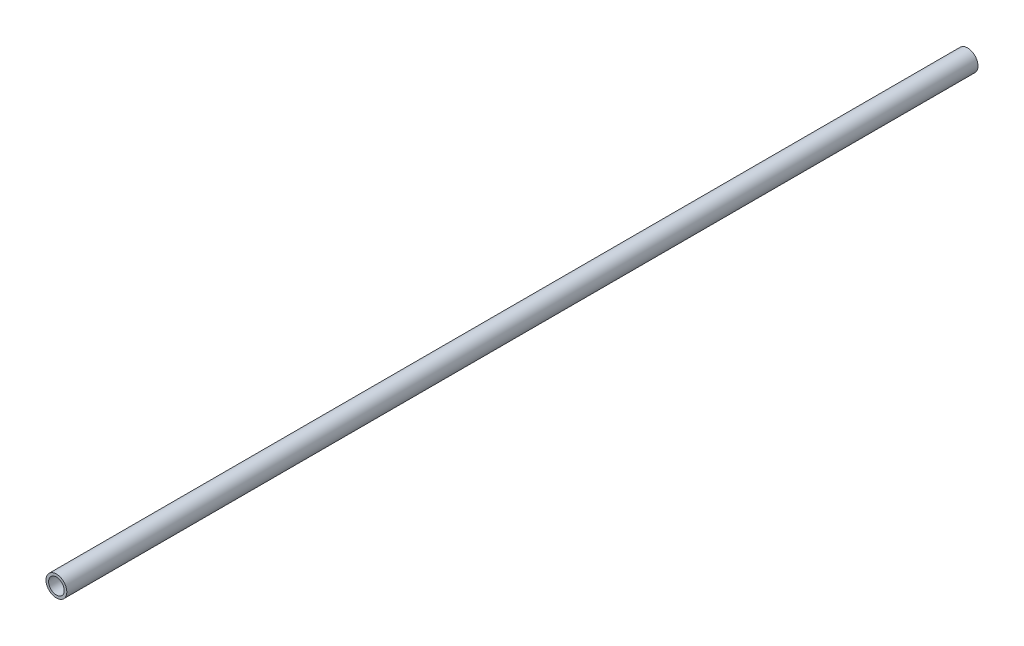
ISO-10303-21;
HEADER;
FILE_DESCRIPTION(('STEP AP214'),'2;1');
FILE_NAME('part.step','',(''),(''),'','','');
FILE_SCHEMA(('AUTOMOTIVE_DESIGN { 1 0 10303 214 1 1 1 1 }'));
ENDSEC;
DATA;
#1=APPLICATION_CONTEXT('core data for automotive mechanical design processes');
#2=APPLICATION_PROTOCOL_DEFINITION('international standard','automotive_design',2000,#1);
#3=PRODUCT_CONTEXT('',#1,'mechanical');
#4=PRODUCT('Part','Part','',(#3));
#5=PRODUCT_RELATED_PRODUCT_CATEGORY('part','',(#4));
#6=PRODUCT_DEFINITION_FORMATION('','',#4);
#7=PRODUCT_DEFINITION_CONTEXT('part definition',#1,'design');
#8=PRODUCT_DEFINITION('design','',#6,#7);
#9=PRODUCT_DEFINITION_SHAPE('','',#8);
#10=(LENGTH_UNIT() NAMED_UNIT(*) SI_UNIT(.MILLI.,.METRE.));
#11=(NAMED_UNIT(*) PLANE_ANGLE_UNIT() SI_UNIT($,.RADIAN.));
#12=(NAMED_UNIT(*) SI_UNIT($,.STERADIAN.) SOLID_ANGLE_UNIT());
#13=UNCERTAINTY_MEASURE_WITH_UNIT(LENGTH_MEASURE(1.E-05),#10,'distance_accuracy_value','');
#14=(GEOMETRIC_REPRESENTATION_CONTEXT(3) GLOBAL_UNCERTAINTY_ASSIGNED_CONTEXT((#13)) GLOBAL_UNIT_ASSIGNED_CONTEXT((#10,
#11,#12)) REPRESENTATION_CONTEXT('',''));
#15=CARTESIAN_POINT('',(0.,0.,0.));
#16=DIRECTION('',(0.,0.,1.));
#17=DIRECTION('',(1.,0.,0.));
#18=AXIS2_PLACEMENT_3D('',#15,#16,#17);
#19=CARTESIAN_POINT('',(0.,0.,350.));
#20=DIRECTION('',(0.,0.,1.));
#21=DIRECTION('',(1.,0.,0.));
#22=AXIS2_PLACEMENT_3D('',#19,#20,#21);
#23=PLANE('',#22);
#24=CARTESIAN_POINT('',(0.,0.,350.));
#25=DIRECTION('',(0.,0.,1.));
#26=DIRECTION('',(1.,0.,0.));
#27=AXIS2_PLACEMENT_3D('',#24,#25,#26);
#28=CIRCLE('',#27,4.);
#29=CARTESIAN_POINT('',(4.,0.,350.));
#30=VERTEX_POINT('',#29);
#31=EDGE_CURVE('E10',#30,#30,#28,.T.);
#32=ORIENTED_EDGE('',*,*,#31,.T.);
#33=EDGE_LOOP('',(#32));
#34=FACE_BOUND('',#33,.T.);
#35=CARTESIAN_POINT('',(0.,0.,350.));
#36=DIRECTION('',(0.,0.,1.));
#37=DIRECTION('',(1.,0.,0.));
#38=AXIS2_PLACEMENT_3D('',#35,#36,#37);
#39=CIRCLE('',#38,3.);
#40=CARTESIAN_POINT('',(3.,0.,350.));
#41=VERTEX_POINT('',#40);
#42=EDGE_CURVE('E46',#41,#41,#39,.T.);
#43=ORIENTED_EDGE('',*,*,#42,.F.);
#44=EDGE_LOOP('',(#43));
#45=FACE_BOUND('',#44,.T.);
#46=ADVANCED_FACE('F35',(#34,#45),#23,.T.);
#47=CARTESIAN_POINT('',(0.,0.,0.));
#48=DIRECTION('',(0.,0.,1.));
#49=DIRECTION('',(1.,0.,0.));
#50=AXIS2_PLACEMENT_3D('',#47,#48,#49);
#51=PLANE('',#50);
#52=CARTESIAN_POINT('',(0.,0.,0.));
#53=DIRECTION('',(0.,0.,1.));
#54=DIRECTION('',(1.,0.,0.));
#55=AXIS2_PLACEMENT_3D('',#52,#53,#54);
#56=CIRCLE('',#55,4.);
#57=CARTESIAN_POINT('',(4.,0.,0.));
#58=VERTEX_POINT('',#57);
#59=EDGE_CURVE('E39',#58,#58,#56,.T.);
#60=ORIENTED_EDGE('',*,*,#59,.F.);
#61=EDGE_LOOP('',(#60));
#62=FACE_BOUND('',#61,.T.);
#63=CARTESIAN_POINT('',(0.,0.,0.));
#64=DIRECTION('',(0.,0.,1.));
#65=DIRECTION('',(1.,0.,0.));
#66=AXIS2_PLACEMENT_3D('',#63,#64,#65);
#67=CIRCLE('',#66,3.);
#68=CARTESIAN_POINT('',(3.,0.,0.));
#69=VERTEX_POINT('',#68);
#70=EDGE_CURVE('E48',#69,#69,#67,.T.);
#71=ORIENTED_EDGE('',*,*,#70,.T.);
#72=EDGE_LOOP('',(#71));
#73=FACE_BOUND('',#72,.T.);
#74=ADVANCED_FACE('F58',(#62,#73),#51,.F.);
#75=CARTESIAN_POINT('',(0.,0.,350.));
#76=DIRECTION('',(0.,0.,-1.));
#77=DIRECTION('',(-1.,0.,0.));
#78=AXIS2_PLACEMENT_3D('',#75,#76,#77);
#79=CYLINDRICAL_SURFACE('',#78,4.);
#80=ORIENTED_EDGE('',*,*,#31,.F.);
#81=EDGE_LOOP('',(#80));
#82=FACE_BOUND('',#81,.T.);
#83=ORIENTED_EDGE('',*,*,#59,.T.);
#84=EDGE_LOOP('',(#83));
#85=FACE_BOUND('',#84,.T.);
#86=ADVANCED_FACE('F37',(#82,#85),#79,.T.);
#87=CARTESIAN_POINT('',(0.,0.,350.));
#88=DIRECTION('',(0.,0.,-1.));
#89=DIRECTION('',(-1.,0.,0.));
#90=AXIS2_PLACEMENT_3D('',#87,#88,#89);
#91=CYLINDRICAL_SURFACE('',#90,3.);
#92=ORIENTED_EDGE('',*,*,#42,.T.);
#93=EDGE_LOOP('',(#92));
#94=FACE_BOUND('',#93,.T.);
#95=ORIENTED_EDGE('',*,*,#70,.F.);
#96=EDGE_LOOP('',(#95));
#97=FACE_BOUND('',#96,.T.);
#98=ADVANCED_FACE('F54',(#94,#97),#91,.F.);
#99=CLOSED_SHELL('',(#46,#74,#86,#98));
#100=MANIFOLD_SOLID_BREP('B2',#99);
#101=ADVANCED_BREP_SHAPE_REPRESENTATION('',(#18,#100),#14);
#102=SHAPE_DEFINITION_REPRESENTATION(#9,#101);
ENDSEC;
END-ISO-10303-21;
